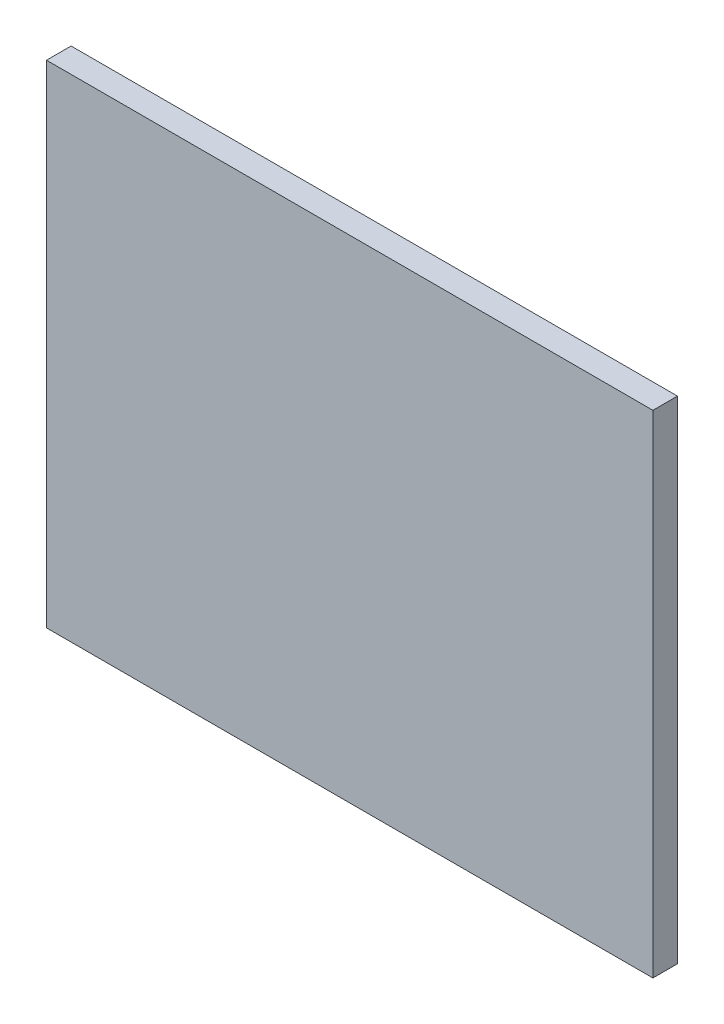
ISO-10303-21;
HEADER;
FILE_DESCRIPTION(('STEP AP214'),'2;1');
FILE_NAME('part.step','',(''),(''),'','','');
FILE_SCHEMA(('AUTOMOTIVE_DESIGN { 1 0 10303 214 1 1 1 1 }'));
ENDSEC;
DATA;
#1=APPLICATION_CONTEXT('core data for automotive mechanical design processes');
#2=APPLICATION_PROTOCOL_DEFINITION('international standard','automotive_design',2000,#1);
#3=PRODUCT_CONTEXT('',#1,'mechanical');
#4=PRODUCT('Part','Part','',(#3));
#5=PRODUCT_RELATED_PRODUCT_CATEGORY('part','',(#4));
#6=PRODUCT_DEFINITION_FORMATION('','',#4);
#7=PRODUCT_DEFINITION_CONTEXT('part definition',#1,'design');
#8=PRODUCT_DEFINITION('design','',#6,#7);
#9=PRODUCT_DEFINITION_SHAPE('','',#8);
#10=(LENGTH_UNIT() NAMED_UNIT(*) SI_UNIT(.MILLI.,.METRE.));
#11=(NAMED_UNIT(*) PLANE_ANGLE_UNIT() SI_UNIT($,.RADIAN.));
#12=(NAMED_UNIT(*) SI_UNIT($,.STERADIAN.) SOLID_ANGLE_UNIT());
#13=UNCERTAINTY_MEASURE_WITH_UNIT(LENGTH_MEASURE(1.E-05),#10,'distance_accuracy_value','');
#14=(GEOMETRIC_REPRESENTATION_CONTEXT(3) GLOBAL_UNCERTAINTY_ASSIGNED_CONTEXT((#13)) GLOBAL_UNIT_ASSIGNED_CONTEXT((#10,
#11,#12)) REPRESENTATION_CONTEXT('',''));
#15=CARTESIAN_POINT('',(0.,0.,0.));
#16=DIRECTION('',(0.,0.,1.));
#17=DIRECTION('',(1.,0.,0.));
#18=AXIS2_PLACEMENT_3D('',#15,#16,#17);
#19=CARTESIAN_POINT('',(0.,0.,3.));
#20=DIRECTION('',(1.,0.,0.));
#21=DIRECTION('',(0.,0.,-1.));
#22=AXIS2_PLACEMENT_3D('',#19,#20,#21);
#23=PLANE('',#22);
#24=DIRECTION('',(0.,-1.,0.));
#25=VECTOR('',#24,1.);
#26=CARTESIAN_POINT('',(0.,0.,0.));
#27=LINE('',#26,#25);
#28=CARTESIAN_POINT('',(0.,60.,0.));
#29=VERTEX_POINT('',#28);
#30=CARTESIAN_POINT('',(0.,0.,0.));
#31=VERTEX_POINT('',#30);
#32=EDGE_CURVE('E100',#29,#31,#27,.T.);
#33=ORIENTED_EDGE('',*,*,#32,.T.);
#34=DIRECTION('',(0.,0.,-1.));
#35=VECTOR('',#34,1.);
#36=CARTESIAN_POINT('',(0.,0.,3.));
#37=LINE('',#36,#35);
#38=CARTESIAN_POINT('',(0.,0.,3.));
#39=VERTEX_POINT('',#38);
#40=EDGE_CURVE('E11',#39,#31,#37,.T.);
#41=ORIENTED_EDGE('',*,*,#40,.F.);
#42=DIRECTION('',(0.,-1.,0.));
#43=VECTOR('',#42,1.);
#44=CARTESIAN_POINT('',(0.,0.,3.));
#45=LINE('',#44,#43);
#46=CARTESIAN_POINT('',(0.,60.,3.));
#47=VERTEX_POINT('',#46);
#48=EDGE_CURVE('E88',#47,#39,#45,.T.);
#49=ORIENTED_EDGE('',*,*,#48,.F.);
#50=DIRECTION('',(0.,0.,-1.));
#51=VECTOR('',#50,1.);
#52=CARTESIAN_POINT('',(0.,60.,3.));
#53=LINE('',#52,#51);
#54=EDGE_CURVE('E96',#47,#29,#53,.T.);
#55=ORIENTED_EDGE('',*,*,#54,.T.);
#56=EDGE_LOOP('',(#33,#41,#49,#55));
#57=FACE_BOUND('',#56,.T.);
#58=ADVANCED_FACE('F37',(#57),#23,.F.);
#59=CARTESIAN_POINT('',(0.,0.,3.));
#60=DIRECTION('',(0.,1.,0.));
#61=DIRECTION('',(0.,0.,1.));
#62=AXIS2_PLACEMENT_3D('',#59,#60,#61);
#63=PLANE('',#62);
#64=DIRECTION('',(1.,0.,0.));
#65=VECTOR('',#64,1.);
#66=CARTESIAN_POINT('',(0.,0.,0.));
#67=LINE('',#66,#65);
#68=CARTESIAN_POINT('',(74.,0.,0.));
#69=VERTEX_POINT('',#68);
#70=EDGE_CURVE('E92',#31,#69,#67,.T.);
#71=ORIENTED_EDGE('',*,*,#70,.T.);
#72=DIRECTION('',(0.,0.,-1.));
#73=VECTOR('',#72,1.);
#74=CARTESIAN_POINT('',(74.,0.,3.));
#75=LINE('',#74,#73);
#76=CARTESIAN_POINT('',(74.,0.,3.));
#77=VERTEX_POINT('',#76);
#78=EDGE_CURVE('E45',#77,#69,#75,.T.);
#79=ORIENTED_EDGE('',*,*,#78,.F.);
#80=DIRECTION('',(1.,0.,0.));
#81=VECTOR('',#80,1.);
#82=CARTESIAN_POINT('',(0.,0.,3.));
#83=LINE('',#82,#81);
#84=EDGE_CURVE('E83',#39,#77,#83,.T.);
#85=ORIENTED_EDGE('',*,*,#84,.F.);
#86=ORIENTED_EDGE('',*,*,#40,.T.);
#87=EDGE_LOOP('',(#71,#79,#85,#86));
#88=FACE_BOUND('',#87,.T.);
#89=ADVANCED_FACE('F91',(#88),#63,.F.);
#90=CARTESIAN_POINT('',(74.,0.,3.));
#91=DIRECTION('',(-1.,0.,0.));
#92=DIRECTION('',(0.,0.,1.));
#93=AXIS2_PLACEMENT_3D('',#90,#91,#92);
#94=PLANE('',#93);
#95=DIRECTION('',(0.,1.,0.));
#96=VECTOR('',#95,1.);
#97=CARTESIAN_POINT('',(74.,0.,0.));
#98=LINE('',#97,#96);
#99=CARTESIAN_POINT('',(74.,60.,0.));
#100=VERTEX_POINT('',#99);
#101=EDGE_CURVE('E70',#69,#100,#98,.T.);
#102=ORIENTED_EDGE('',*,*,#101,.T.);
#103=DIRECTION('',(0.,0.,-1.));
#104=VECTOR('',#103,1.);
#105=CARTESIAN_POINT('',(74.,60.,3.));
#106=LINE('',#105,#104);
#107=CARTESIAN_POINT('',(74.,60.,3.));
#108=VERTEX_POINT('',#107);
#109=EDGE_CURVE('E93',#108,#100,#106,.T.);
#110=ORIENTED_EDGE('',*,*,#109,.F.);
#111=DIRECTION('',(0.,1.,0.));
#112=VECTOR('',#111,1.);
#113=CARTESIAN_POINT('',(74.,0.,3.));
#114=LINE('',#113,#112);
#115=EDGE_CURVE('E86',#77,#108,#114,.T.);
#116=ORIENTED_EDGE('',*,*,#115,.F.);
#117=ORIENTED_EDGE('',*,*,#78,.T.);
#118=EDGE_LOOP('',(#102,#110,#116,#117));
#119=FACE_BOUND('',#118,.T.);
#120=ADVANCED_FACE('F94',(#119),#94,.F.);
#121=CARTESIAN_POINT('',(0.,60.,3.));
#122=DIRECTION('',(0.,-1.,0.));
#123=DIRECTION('',(0.,0.,-1.));
#124=AXIS2_PLACEMENT_3D('',#121,#122,#123);
#125=PLANE('',#124);
#126=DIRECTION('',(-1.,0.,0.));
#127=VECTOR('',#126,1.);
#128=CARTESIAN_POINT('',(0.,60.,0.));
#129=LINE('',#128,#127);
#130=EDGE_CURVE('E76',#100,#29,#129,.T.);
#131=ORIENTED_EDGE('',*,*,#130,.T.);
#132=ORIENTED_EDGE('',*,*,#54,.F.);
#133=DIRECTION('',(-1.,0.,0.));
#134=VECTOR('',#133,1.);
#135=CARTESIAN_POINT('',(0.,60.,3.));
#136=LINE('',#135,#134);
#137=EDGE_CURVE('E53',#108,#47,#136,.T.);
#138=ORIENTED_EDGE('',*,*,#137,.F.);
#139=ORIENTED_EDGE('',*,*,#109,.T.);
#140=EDGE_LOOP('',(#131,#132,#138,#139));
#141=FACE_BOUND('',#140,.T.);
#142=ADVANCED_FACE('F107',(#141),#125,.F.);
#143=CARTESIAN_POINT('',(0.,0.,3.));
#144=DIRECTION('',(0.,0.,-1.));
#145=DIRECTION('',(-1.,0.,0.));
#146=AXIS2_PLACEMENT_3D('',#143,#144,#145);
#147=PLANE('',#146);
#148=ORIENTED_EDGE('',*,*,#48,.T.);
#149=ORIENTED_EDGE('',*,*,#84,.T.);
#150=ORIENTED_EDGE('',*,*,#115,.T.);
#151=ORIENTED_EDGE('',*,*,#137,.T.);
#152=EDGE_LOOP('',(#148,#149,#150,#151));
#153=FACE_BOUND('',#152,.T.);
#154=ADVANCED_FACE('F84',(#153),#147,.F.);
#155=CARTESIAN_POINT('',(0.,0.,0.));
#156=DIRECTION('',(0.,0.,-1.));
#157=DIRECTION('',(-1.,0.,0.));
#158=AXIS2_PLACEMENT_3D('',#155,#156,#157);
#159=PLANE('',#158);
#160=ORIENTED_EDGE('',*,*,#32,.F.);
#161=ORIENTED_EDGE('',*,*,#130,.F.);
#162=ORIENTED_EDGE('',*,*,#101,.F.);
#163=ORIENTED_EDGE('',*,*,#70,.F.);
#164=EDGE_LOOP('',(#160,#161,#162,#163));
#165=FACE_BOUND('',#164,.T.);
#166=ADVANCED_FACE('F110',(#165),#159,.T.);
#167=CLOSED_SHELL('',(#58,#89,#120,#142,#154,#166));
#168=MANIFOLD_SOLID_BREP('B2',#167);
#169=ADVANCED_BREP_SHAPE_REPRESENTATION('',(#18,#168),#14);
#170=SHAPE_DEFINITION_REPRESENTATION(#9,#169);
ENDSEC;
END-ISO-10303-21;
